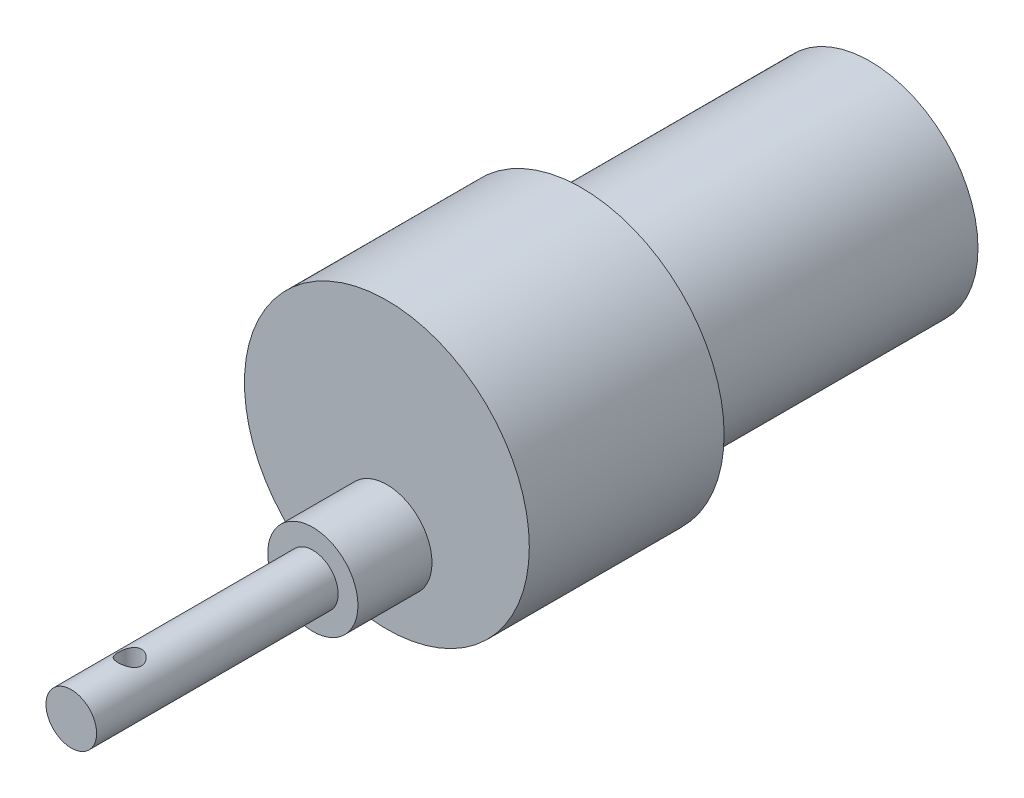
ISO-10303-21;
HEADER;
FILE_DESCRIPTION(('STEP AP214'),'2;1');
FILE_NAME('part.step','',(''),(''),'','','');
FILE_SCHEMA(('AUTOMOTIVE_DESIGN { 1 0 10303 214 1 1 1 1 }'));
ENDSEC;
DATA;
#1=APPLICATION_CONTEXT('core data for automotive mechanical design processes');
#2=APPLICATION_PROTOCOL_DEFINITION('international standard','automotive_design',2000,#1);
#3=PRODUCT_CONTEXT('',#1,'mechanical');
#4=PRODUCT('Part','Part','',(#3));
#5=PRODUCT_RELATED_PRODUCT_CATEGORY('part','',(#4));
#6=PRODUCT_DEFINITION_FORMATION('','',#4);
#7=PRODUCT_DEFINITION_CONTEXT('part definition',#1,'design');
#8=PRODUCT_DEFINITION('design','',#6,#7);
#9=PRODUCT_DEFINITION_SHAPE('','',#8);
#10=(LENGTH_UNIT() NAMED_UNIT(*) SI_UNIT(.MILLI.,.METRE.));
#11=(NAMED_UNIT(*) PLANE_ANGLE_UNIT() SI_UNIT($,.RADIAN.));
#12=(NAMED_UNIT(*) SI_UNIT($,.STERADIAN.) SOLID_ANGLE_UNIT());
#13=UNCERTAINTY_MEASURE_WITH_UNIT(LENGTH_MEASURE(1.E-05),#10,'distance_accuracy_value','');
#14=(GEOMETRIC_REPRESENTATION_CONTEXT(3) GLOBAL_UNCERTAINTY_ASSIGNED_CONTEXT((#13)) GLOBAL_UNIT_ASSIGNED_CONTEXT((#10,
#11,#12)) REPRESENTATION_CONTEXT('',''));
#15=CARTESIAN_POINT('',(0.,0.,0.));
#16=DIRECTION('',(0.,0.,1.));
#17=DIRECTION('',(1.,0.,0.));
#18=AXIS2_PLACEMENT_3D('',#15,#16,#17);
#19=CARTESIAN_POINT('',(0.,0.,62.));
#20=DIRECTION('',(0.,0.,-1.));
#21=DIRECTION('',(-1.,0.,0.));
#22=AXIS2_PLACEMENT_3D('',#19,#20,#21);
#23=CYLINDRICAL_SURFACE('',#22,13.86);
#24=CARTESIAN_POINT('',(0.,0.,0.));
#25=DIRECTION('',(0.,0.,1.));
#26=DIRECTION('',(1.,0.,0.));
#27=AXIS2_PLACEMENT_3D('',#24,#25,#26);
#28=CIRCLE('',#27,13.86);
#29=CARTESIAN_POINT('',(13.86,0.,0.));
#30=VERTEX_POINT('',#29);
#31=EDGE_CURVE('E57',#30,#30,#28,.T.);
#32=ORIENTED_EDGE('',*,*,#31,.T.);
#33=EDGE_LOOP('',(#32));
#34=FACE_BOUND('',#33,.T.);
#35=CARTESIAN_POINT('',(0.,0.,37.));
#36=DIRECTION('',(0.,0.,1.));
#37=DIRECTION('',(1.,0.,0.));
#38=AXIS2_PLACEMENT_3D('',#35,#36,#37);
#39=CIRCLE('',#38,13.86);
#40=CARTESIAN_POINT('',(13.86,0.,37.));
#41=VERTEX_POINT('',#40);
#42=EDGE_CURVE('E51',#41,#41,#39,.T.);
#43=ORIENTED_EDGE('',*,*,#42,.F.);
#44=EDGE_LOOP('',(#43));
#45=FACE_BOUND('',#44,.T.);
#46=ADVANCED_FACE('F38',(#34,#45),#23,.T.);
#47=CARTESIAN_POINT('',(0.,0.,0.));
#48=DIRECTION('',(0.,0.,1.));
#49=DIRECTION('',(1.,0.,0.));
#50=AXIS2_PLACEMENT_3D('',#47,#48,#49);
#51=PLANE('',#50);
#52=ORIENTED_EDGE('',*,*,#31,.F.);
#53=EDGE_LOOP('',(#52));
#54=FACE_BOUND('',#53,.T.);
#55=ADVANCED_FACE('F106',(#54),#51,.F.);
#56=CARTESIAN_POINT('',(0.,0.,62.));
#57=DIRECTION('',(0.,0.,-1.));
#58=DIRECTION('',(-1.,0.,0.));
#59=AXIS2_PLACEMENT_3D('',#56,#57,#58);
#60=CYLINDRICAL_SURFACE('',#59,18.28);
#61=CARTESIAN_POINT('',(0.,0.,62.));
#62=DIRECTION('',(0.,0.,1.));
#63=DIRECTION('',(1.,0.,0.));
#64=AXIS2_PLACEMENT_3D('',#61,#62,#63);
#65=CIRCLE('',#64,18.28);
#66=CARTESIAN_POINT('',(18.28,0.,62.));
#67=VERTEX_POINT('',#66);
#68=EDGE_CURVE('E71',#67,#67,#65,.T.);
#69=ORIENTED_EDGE('',*,*,#68,.F.);
#70=EDGE_LOOP('',(#69));
#71=FACE_BOUND('',#70,.T.);
#72=CARTESIAN_POINT('',(0.,0.,37.));
#73=DIRECTION('',(0.,0.,1.));
#74=DIRECTION('',(1.,0.,0.));
#75=AXIS2_PLACEMENT_3D('',#72,#73,#74);
#76=CIRCLE('',#75,18.28);
#77=CARTESIAN_POINT('',(18.28,0.,37.));
#78=VERTEX_POINT('',#77);
#79=EDGE_CURVE('E66',#78,#78,#76,.T.);
#80=ORIENTED_EDGE('',*,*,#79,.T.);
#81=EDGE_LOOP('',(#80));
#82=FACE_BOUND('',#81,.T.);
#83=ADVANCED_FACE('F111',(#71,#82),#60,.T.);
#84=CARTESIAN_POINT('',(0.,0.,37.));
#85=DIRECTION('',(0.,0.,1.));
#86=DIRECTION('',(1.,0.,0.));
#87=AXIS2_PLACEMENT_3D('',#84,#85,#86);
#88=PLANE('',#87);
#89=ORIENTED_EDGE('',*,*,#42,.T.);
#90=EDGE_LOOP('',(#89));
#91=FACE_BOUND('',#90,.T.);
#92=ORIENTED_EDGE('',*,*,#79,.F.);
#93=EDGE_LOOP('',(#92));
#94=FACE_BOUND('',#93,.T.);
#95=ADVANCED_FACE('F117',(#91,#94),#88,.F.);
#96=CARTESIAN_POINT('',(0.,0.,62.));
#97=DIRECTION('',(0.,0.,1.));
#98=DIRECTION('',(1.,0.,0.));
#99=AXIS2_PLACEMENT_3D('',#96,#97,#98);
#100=PLANE('',#99);
#101=CARTESIAN_POINT('',(0.,-7.99,62.));
#102=DIRECTION('',(0.,0.,1.));
#103=DIRECTION('',(1.,0.,0.));
#104=AXIS2_PLACEMENT_3D('',#101,#102,#103);
#105=CIRCLE('',#104,5.79);
#106=CARTESIAN_POINT('',(5.79,-7.99,62.));
#107=VERTEX_POINT('',#106);
#108=EDGE_CURVE('E67',#107,#107,#105,.T.);
#109=ORIENTED_EDGE('',*,*,#108,.F.);
#110=EDGE_LOOP('',(#109));
#111=FACE_BOUND('',#110,.T.);
#112=ORIENTED_EDGE('',*,*,#68,.T.);
#113=EDGE_LOOP('',(#112));
#114=FACE_BOUND('',#113,.T.);
#115=ADVANCED_FACE('F120',(#111,#114),#100,.T.);
#116=CARTESIAN_POINT('',(0.,-7.99,71.5));
#117=DIRECTION('',(0.,0.,-1.));
#118=DIRECTION('',(-1.,0.,0.));
#119=AXIS2_PLACEMENT_3D('',#116,#117,#118);
#120=CYLINDRICAL_SURFACE('',#119,5.79);
#121=CARTESIAN_POINT('',(0.,-7.99,71.5));
#122=DIRECTION('',(0.,0.,1.));
#123=DIRECTION('',(1.,0.,0.));
#124=AXIS2_PLACEMENT_3D('',#121,#122,#123);
#125=CIRCLE('',#124,5.79);
#126=CARTESIAN_POINT('',(5.79,-7.99,71.5));
#127=VERTEX_POINT('',#126);
#128=EDGE_CURVE('E62',#127,#127,#125,.T.);
#129=ORIENTED_EDGE('',*,*,#128,.F.);
#130=EDGE_LOOP('',(#129));
#131=FACE_BOUND('',#130,.T.);
#132=ORIENTED_EDGE('',*,*,#108,.T.);
#133=EDGE_LOOP('',(#132));
#134=FACE_BOUND('',#133,.T.);
#135=ADVANCED_FACE('F133',(#131,#134),#120,.T.);
#136=CARTESIAN_POINT('',(0.,-7.99,71.5));
#137=DIRECTION('',(0.,0.,1.));
#138=DIRECTION('',(1.,0.,0.));
#139=AXIS2_PLACEMENT_3D('',#136,#137,#138);
#140=PLANE('',#139);
#141=CARTESIAN_POINT('',(0.,-7.99,71.5));
#142=DIRECTION('',(0.,0.,1.));
#143=DIRECTION('',(1.,0.,0.));
#144=AXIS2_PLACEMENT_3D('',#141,#142,#143);
#145=CIRCLE('',#144,3.25);
#146=CARTESIAN_POINT('',(3.25,-7.99,71.5));
#147=VERTEX_POINT('',#146);
#148=EDGE_CURVE('E10',#147,#147,#145,.T.);
#149=ORIENTED_EDGE('',*,*,#148,.F.);
#150=EDGE_LOOP('',(#149));
#151=FACE_BOUND('',#150,.T.);
#152=ORIENTED_EDGE('',*,*,#128,.T.);
#153=EDGE_LOOP('',(#152));
#154=FACE_BOUND('',#153,.T.);
#155=ADVANCED_FACE('F102',(#151,#154),#140,.T.);
#156=CARTESIAN_POINT('',(0.,-7.99,102.5));
#157=DIRECTION('',(0.,0.,-1.));
#158=DIRECTION('',(-1.,0.,0.));
#159=AXIS2_PLACEMENT_3D('',#156,#157,#158);
#160=CYLINDRICAL_SURFACE('',#159,3.25);
#161=CARTESIAN_POINT('',(0.,-11.24,96.5));
#162=CARTESIAN_POINT('',(0.0795665336020402,-11.2399964824728,96.499995787521));
#163=CARTESIAN_POINT('',(0.159248802751997,-11.2370457852304,96.4936318652864));
#164=CARTESIAN_POINT('',(0.316302676462146,-11.2255347898597,96.4684368188158));
#165=CARTESIAN_POINT('',(0.393668644355887,-11.2169618132245,96.4495775159126));
#166=CARTESIAN_POINT('',(0.543571236651895,-11.1951126172015,96.4002613390825));
#167=CARTESIAN_POINT('',(0.616124459577149,-11.1818536812406,96.369847053397));
#168=CARTESIAN_POINT('',(0.75501150586327,-11.1518842864362,96.2984831664503));
#169=CARTESIAN_POINT('',(0.821346455351669,-11.1351744543117,96.2575354778342));
#170=CARTESIAN_POINT('',(0.949934488652826,-11.0988303550097,96.1637412957995));
#171=CARTESIAN_POINT('',(1.01177584846844,-11.0790871070793,96.1103730891206));
#172=CARTESIAN_POINT('',(1.12599874800721,-11.0393100602554,95.9943643723519));
#173=CARTESIAN_POINT('',(1.17837420047774,-11.0192760832839,95.9317179424784));
#174=CARTESIAN_POINT('',(1.27548887178323,-10.9797410102294,95.7941390566843));
#175=CARTESIAN_POINT('',(1.31953284801044,-10.9603543512364,95.7186793017865));
#176=CARTESIAN_POINT('',(1.39412192936299,-10.9260893954615,95.5604132530109));
#177=CARTESIAN_POINT('',(1.42467548371612,-10.9112082786405,95.4776115966009));
#178=CARTESIAN_POINT('',(1.46962454078475,-10.8888457139591,95.3117245268469));
#179=CARTESIAN_POINT('',(1.4848179245708,-10.8810015734653,95.2289063804143));
#180=CARTESIAN_POINT('',(1.50108773838038,-10.8725906668659,95.0615542706928));
#181=CARTESIAN_POINT('',(1.50217478633585,-10.8720184271594,94.9770216459131));
#182=CARTESIAN_POINT('',(1.49079280088205,-10.8779164235216,94.8175256844061));
#183=CARTESIAN_POINT('',(1.47964335102251,-10.8837011993326,94.7424372111908));
#184=CARTESIAN_POINT('',(1.44635609280636,-10.9004806782819,94.5953488838788));
#185=CARTESIAN_POINT('',(1.42421554815286,-10.911476678754,94.5233498037562));
#186=CARTESIAN_POINT('',(1.36913890476633,-10.9376945635919,94.3824957158733));
#187=CARTESIAN_POINT('',(1.33596673085205,-10.9530076322656,94.3137507726206));
#188=CARTESIAN_POINT('',(1.2599408085694,-10.9861251942995,94.1824992310562));
#189=CARTESIAN_POINT('',(1.21708286028503,-11.0039307671733,94.1199953559801));
#190=CARTESIAN_POINT('',(1.11759089744586,-11.0423140447298,93.9960295930866));
#191=CARTESIAN_POINT('',(1.05997849303938,-11.0629856005201,93.9353794713411));
#192=CARTESIAN_POINT('',(0.93525063284136,-11.1032136151515,93.8242944951355));
#193=CARTESIAN_POINT('',(0.868131859637581,-11.1227696813672,93.7738632217161));
#194=CARTESIAN_POINT('',(0.723348423753627,-11.1593883778069,93.6830680936934));
#195=CARTESIAN_POINT('',(0.645401966429369,-11.1763430967401,93.6431066922417));
#196=CARTESIAN_POINT('',(0.482909298354606,-11.2049781510309,93.5771606394507));
#197=CARTESIAN_POINT('',(0.398367620109635,-11.2166620718881,93.5511664844807));
#198=CARTESIAN_POINT('',(0.231801419726399,-11.2327218040747,93.5157584231729));
#199=CARTESIAN_POINT('',(0.150053680320634,-11.2375744913158,93.5052597924311));
#200=CARTESIAN_POINT('',(-0.0141754579229681,-11.241005131626,93.4978189350661));
#201=CARTESIAN_POINT('',(-0.0966565689646179,-11.2395854463303,93.5008716061922));
#202=CARTESIAN_POINT('',(-0.254447728851398,-11.2309269508323,93.5197405086181));
#203=CARTESIAN_POINT('',(-0.329879815922768,-11.2240647154841,93.534731016318));
#204=CARTESIAN_POINT('',(-0.47703968174818,-11.205654730005,93.5758259707681));
#205=CARTESIAN_POINT('',(-0.548767021851264,-11.1941064264594,93.6019317302237));
#206=CARTESIAN_POINT('',(-0.689005049925919,-11.1669534581523,93.6653176562795));
#207=CARTESIAN_POINT('',(-0.75734840788269,-11.1512347190555,93.7029174973217));
#208=CARTESIAN_POINT('',(-0.886999363186387,-11.1173358986766,93.7878753743237));
#209=CARTESIAN_POINT('',(-0.948303850462297,-11.0991547370659,93.8352376981244));
#210=CARTESIAN_POINT('',(-1.06771605589661,-11.0603024090195,93.9431170185809));
#211=CARTESIAN_POINT('',(-1.12509321772053,-11.0395516736676,94.0044158349319));
#212=CARTESIAN_POINT('',(-1.22901796417977,-10.9991743111415,94.1359711553179));
#213=CARTESIAN_POINT('',(-1.27556070251233,-10.9795481899615,94.206231646296));
#214=CARTESIAN_POINT('',(-1.35774539209929,-10.9431533168398,94.3565122225598));
#215=CARTESIAN_POINT('',(-1.39301513194685,-10.9264889220204,94.4367631918532));
#216=CARTESIAN_POINT('',(-1.44918714325353,-10.8991835105804,94.6030877230937));
#217=CARTESIAN_POINT('',(-1.47010488786372,-10.8885360092279,94.689154904117));
#218=CARTESIAN_POINT('',(-1.49529060984287,-10.8756174532217,94.8564321692355));
#219=CARTESIAN_POINT('',(-1.50087454782971,-10.8726853235251,94.9373929418536));
#220=CARTESIAN_POINT('',(-1.49890349615771,-10.8737114444469,95.0990993783274));
#221=CARTESIAN_POINT('',(-1.49135196602765,-10.8776678808026,95.179845093214));
#222=CARTESIAN_POINT('',(-1.4645026372222,-10.89136714358,95.3329450912279));
#223=CARTESIAN_POINT('',(-1.44606164108053,-10.9006867438273,95.4054916725594));
#224=CARTESIAN_POINT('',(-1.39890570133608,-10.9236404902673,95.5464331262932));
#225=CARTESIAN_POINT('',(-1.37018772156748,-10.9372759113608,95.6148267647851));
#226=CARTESIAN_POINT('',(-1.30114142777073,-10.9684312806135,95.7504660004963));
#227=CARTESIAN_POINT('',(-1.26017322224184,-10.9861478662505,95.8173395867084));
#228=CARTESIAN_POINT('',(-1.16858143831045,-11.0230436879651,95.9436688753762));
#229=CARTESIAN_POINT('',(-1.1179534539562,-11.0422235890751,96.0031211723353));
#230=CARTESIAN_POINT('',(-1.00267081983322,-11.0821220762857,96.1189084266444));
#231=CARTESIAN_POINT('',(-0.93713072208963,-11.1028088140642,96.1743773440259));
#232=CARTESIAN_POINT('',(-0.796983612052282,-11.1416023694661,96.2736519598549));
#233=CARTESIAN_POINT('',(-0.722372364022922,-11.1597079732006,96.3174521789542));
#234=CARTESIAN_POINT('',(-0.566452903867861,-11.1912362062055,96.3915937351064));
#235=CARTESIAN_POINT('',(-0.485194228853798,-11.2046901573167,96.4220254800127));
#236=CARTESIAN_POINT('',(-0.318047129151273,-11.2254884135612,96.468442221957));
#237=CARTESIAN_POINT('',(-0.232173392454843,-11.2328510059526,96.4844704732234));
#238=CARTESIAN_POINT('',(-0.121381352624889,-11.2378239925252,96.4952796609948));
#239=CARTESIAN_POINT('',(-0.0971493876498588,-11.2386384195862,96.4970479318607));
#240=CARTESIAN_POINT('',(-0.0486152181100391,-11.2397269656243,96.4994087555787));
#241=CARTESIAN_POINT('',(-0.0243130122848309,-11.2400010748449,96.5000012872002));
#242=CARTESIAN_POINT('',(0.,-11.24,96.5));
#243=B_SPLINE_CURVE_WITH_KNOTS('',3,(#161,#162,#163,#164,#165,#166,#167,#168,#169,#170,#171,
#172,#173,#174,#175,#176,#177,#178,#179,#180,#181,#182,#183,#184,#185,#186,#187,#188,#189,#190,
#191,#192,#193,#194,#195,#196,#197,#198,#199,#200,#201,#202,#203,#204,#205,#206,#207,#208,#209,
#210,#211,#212,#213,#214,#215,#216,#217,#218,#219,#220,#221,#222,#223,#224,#225,#226,#227,#228,
#229,#230,#231,#232,#233,#234,#235,#236,#237,#238,#239,#240,#241,#242),.UNSPECIFIED.,.T.,.F.,(4,
2,2,2,2,2,2,2,2,2,2,2,2,2,2,2,2,2,2,2,2,2,2,2,2,2,2,2,2,2,2,2,2,2,2,2,2,2,2,2,4),(0.,
0.238600102483911,0.477740118245305,0.716007153654809,0.954230955270989,1.20527368348811,
1.45647728005177,1.72361737244145,1.99058991333629,2.24284530975918,2.49491082085965,
2.72224505371486,2.94963591115234,3.18224489338961,3.41495493301191,3.67231630672516,
3.92976771345169,4.19600797435802,4.46206684922304,4.70843465098173,4.95470969975968,
5.18529144757862,5.41590043453886,5.65361863134685,5.89144146118222,6.14975555625564,
6.40818497569821,6.67442949381562,6.94038651584685,7.18267705005868,7.42490378112663,
7.65022078469501,7.87560440949581,8.11582604918685,8.35615752018291,8.6198711271926,
8.88370835055028,9.14573275427445,9.40696763362013,9.47987495044763,9.55278358376661),.UNSPECIFIED.);
#244=CARTESIAN_POINT('',(0.,-11.24,96.5));
#245=VERTEX_POINT('',#244);
#246=EDGE_CURVE('E41',#245,#245,#243,.T.);
#247=ORIENTED_EDGE('',*,*,#246,.T.);
#248=EDGE_LOOP('',(#247));
#249=FACE_BOUND('',#248,.T.);
#250=CARTESIAN_POINT('',(0.,-4.74,96.5));
#251=CARTESIAN_POINT('',(-0.0795665336020402,-4.74000351752723,96.499995787521));
#252=CARTESIAN_POINT('',(-0.159248802751997,-4.74295421476959,96.4936318652864));
#253=CARTESIAN_POINT('',(-0.316302676462146,-4.7544652101403,96.4684368188158));
#254=CARTESIAN_POINT('',(-0.393668644355887,-4.76303818677546,96.4495775159126));
#255=CARTESIAN_POINT('',(-0.543571236651895,-4.7848873827985,96.4002613390825));
#256=CARTESIAN_POINT('',(-0.616124459577149,-4.79814631875943,96.369847053397));
#257=CARTESIAN_POINT('',(-0.75501150586327,-4.82811571356377,96.2984831664503));
#258=CARTESIAN_POINT('',(-0.821346455351669,-4.84482554568835,96.2575354778342));
#259=CARTESIAN_POINT('',(-0.949934488652826,-4.88116964499027,96.1637412957995));
#260=CARTESIAN_POINT('',(-1.01177584846844,-4.90091289292072,96.1103730891206));
#261=CARTESIAN_POINT('',(-1.12599874800721,-4.94068993974456,95.9943643723519));
#262=CARTESIAN_POINT('',(-1.17837420047774,-4.96072391671612,95.9317179424784));
#263=CARTESIAN_POINT('',(-1.27548887178323,-5.00025898977059,95.7941390566843));
#264=CARTESIAN_POINT('',(-1.31953284801044,-5.01964564876359,95.7186793017865));
#265=CARTESIAN_POINT('',(-1.39412192936299,-5.05391060453849,95.5604132530109));
#266=CARTESIAN_POINT('',(-1.42467548371612,-5.06879172135948,95.4776115966009));
#267=CARTESIAN_POINT('',(-1.46962454078475,-5.09115428604094,95.3117245268469));
#268=CARTESIAN_POINT('',(-1.4848179245708,-5.0989984265347,95.2289063804143));
#269=CARTESIAN_POINT('',(-1.50108773838038,-5.10740933313408,95.0615542706928));
#270=CARTESIAN_POINT('',(-1.50217478633585,-5.10798157284062,94.9770216459131));
#271=CARTESIAN_POINT('',(-1.49079280088205,-5.10208357647845,94.8175256844061));
#272=CARTESIAN_POINT('',(-1.47964335102251,-5.09629880066741,94.7424372111908));
#273=CARTESIAN_POINT('',(-1.44635609280636,-5.07951932171808,94.5953488838788));
#274=CARTESIAN_POINT('',(-1.42421554815286,-5.06852332124604,94.5233498037562));
#275=CARTESIAN_POINT('',(-1.36913890476633,-5.04230543640806,94.3824957158733));
#276=CARTESIAN_POINT('',(-1.33596673085205,-5.02699236773443,94.3137507726206));
#277=CARTESIAN_POINT('',(-1.2599408085694,-4.99387480570052,94.1824992310562));
#278=CARTESIAN_POINT('',(-1.21708286028503,-4.97606923282669,94.1199953559801));
#279=CARTESIAN_POINT('',(-1.11759089744586,-4.93768595527021,93.9960295930866));
#280=CARTESIAN_POINT('',(-1.05997849303938,-4.91701439947994,93.9353794713411));
#281=CARTESIAN_POINT('',(-0.935250632841355,-4.87678638484851,93.8242944951355));
#282=CARTESIAN_POINT('',(-0.868131859637579,-4.85723031863276,93.7738632217161));
#283=CARTESIAN_POINT('',(-0.723348423753627,-4.82061162219313,93.6830680936934));
#284=CARTESIAN_POINT('',(-0.64540196642937,-4.80365690325991,93.6431066922417));
#285=CARTESIAN_POINT('',(-0.482909298354606,-4.77502184896911,93.5771606394507));
#286=CARTESIAN_POINT('',(-0.398367620109635,-4.76333792811189,93.5511664844807));
#287=CARTESIAN_POINT('',(-0.231801419726399,-4.7472781959253,93.5157584231729));
#288=CARTESIAN_POINT('',(-0.150053680320635,-4.74242550868423,93.5052597924311));
#289=CARTESIAN_POINT('',(0.0141754579229679,-4.73899486837397,93.4978189350661));
#290=CARTESIAN_POINT('',(0.096656568964618,-4.7404145536697,93.5008716061922));
#291=CARTESIAN_POINT('',(0.254447728851401,-4.74907304916771,93.5197405086181));
#292=CARTESIAN_POINT('',(0.329879815922774,-4.75593528451591,93.534731016318));
#293=CARTESIAN_POINT('',(0.477039681748186,-4.77434526999505,93.5758259707681));
#294=CARTESIAN_POINT('',(0.548767021851267,-4.78589357354064,93.6019317302237));
#295=CARTESIAN_POINT('',(0.689005049925918,-4.81304654184772,93.6653176562795));
#296=CARTESIAN_POINT('',(0.757348407882689,-4.8287652809445,93.7029174973217));
#297=CARTESIAN_POINT('',(0.886999363186382,-4.86266410132341,93.7878753743237));
#298=CARTESIAN_POINT('',(0.948303850462288,-4.88084526293413,93.8352376981244));
#299=CARTESIAN_POINT('',(1.0677160558966,-4.91969759098051,93.9431170185809));
#300=CARTESIAN_POINT('',(1.12509321772053,-4.94044832633235,94.0044158349319));
#301=CARTESIAN_POINT('',(1.22901796417977,-4.98082568885848,94.1359711553179));
#302=CARTESIAN_POINT('',(1.27556070251232,-5.00045181003849,94.206231646296));
#303=CARTESIAN_POINT('',(1.35774539209928,-5.03684668316023,94.3565122225598));
#304=CARTESIAN_POINT('',(1.39301513194685,-5.05351107797963,94.4367631918531));
#305=CARTESIAN_POINT('',(1.44918714325354,-5.08081648941964,94.6030877230937));
#306=CARTESIAN_POINT('',(1.47010488786372,-5.09146399077208,94.6891549041169));
#307=CARTESIAN_POINT('',(1.49529060984287,-5.10438254677831,94.8564321692355));
#308=CARTESIAN_POINT('',(1.50087454782971,-5.1073146764749,94.9373929418536));
#309=CARTESIAN_POINT('',(1.49890349615771,-5.10628855555312,95.0990993783274));
#310=CARTESIAN_POINT('',(1.49135196602765,-5.10233211919738,95.179845093214));
#311=CARTESIAN_POINT('',(1.4645026372222,-5.08863285641999,95.3329450912279));
#312=CARTESIAN_POINT('',(1.44606164108053,-5.07931325617275,95.4054916725594));
#313=CARTESIAN_POINT('',(1.39890570133608,-5.05635950973268,95.5464331262932));
#314=CARTESIAN_POINT('',(1.37018772156748,-5.04272408863924,95.6148267647851));
#315=CARTESIAN_POINT('',(1.30114142777073,-5.01156871938648,95.7504660004963));
#316=CARTESIAN_POINT('',(1.26017322224184,-4.99385213374951,95.8173395867084));
#317=CARTESIAN_POINT('',(1.16858143831045,-4.9569563120349,95.9436688753762));
#318=CARTESIAN_POINT('',(1.1179534539562,-4.93777641092492,96.0031211723353));
#319=CARTESIAN_POINT('',(1.00267081983322,-4.89787792371429,96.1189084266444));
#320=CARTESIAN_POINT('',(0.93713072208963,-4.8771911859358,96.1743773440259));
#321=CARTESIAN_POINT('',(0.796983612052281,-4.83839763053393,96.2736519598549));
#322=CARTESIAN_POINT('',(0.722372364022921,-4.82029202679941,96.3174521789542));
#323=CARTESIAN_POINT('',(0.566452903867861,-4.7887637937945,96.3915937351064));
#324=CARTESIAN_POINT('',(0.485194228853799,-4.77530984268335,96.4220254800127));
#325=CARTESIAN_POINT('',(0.318047129151273,-4.75451158643877,96.468442221957));
#326=CARTESIAN_POINT('',(0.232173392454843,-4.74714899404736,96.4844704732234));
#327=CARTESIAN_POINT('',(0.121381352624889,-4.74217600747479,96.4952796609948));
#328=CARTESIAN_POINT('',(0.0971493876498584,-4.74136158041381,96.4970479318607));
#329=CARTESIAN_POINT('',(0.048615218110039,-4.74027303437565,96.4994087555787));
#330=CARTESIAN_POINT('',(0.0243130122848308,-4.7399989251551,96.5000012872002));
#331=CARTESIAN_POINT('',(0.,-4.74,96.5));
#332=B_SPLINE_CURVE_WITH_KNOTS('',3,(#250,#251,#252,#253,#254,#255,#256,#257,#258,#259,#260,
#261,#262,#263,#264,#265,#266,#267,#268,#269,#270,#271,#272,#273,#274,#275,#276,#277,#278,#279,
#280,#281,#282,#283,#284,#285,#286,#287,#288,#289,#290,#291,#292,#293,#294,#295,#296,#297,#298,
#299,#300,#301,#302,#303,#304,#305,#306,#307,#308,#309,#310,#311,#312,#313,#314,#315,#316,#317,
#318,#319,#320,#321,#322,#323,#324,#325,#326,#327,#328,#329,#330,#331),.UNSPECIFIED.,.T.,.F.,(4,
2,2,2,2,2,2,2,2,2,2,2,2,2,2,2,2,2,2,2,2,2,2,2,2,2,2,2,2,2,2,2,2,2,2,2,2,2,2,2,4),(0.,
0.23860010248391,0.477740118245305,0.716007153654809,0.954230955270988,1.20527368348811,
1.45647728005177,1.72361737244145,1.99058991333629,2.24284530975918,2.49491082085965,
2.72224505371486,2.94963591115234,3.18224489338961,3.41495493301191,3.67231630672516,
3.92976771345169,4.19600797435802,4.46206684922304,4.70843465098173,4.95470969975968,
5.18529144757863,5.41590043453886,5.65361863134685,5.8914414611822,6.14975555625562,
6.4081849756982,6.6744294938156,6.94038651584684,7.18267705005868,7.42490378112662,
7.650220784695,7.8756044094958,8.11582604918685,8.3561575201829,8.61987112719259,
8.88370835055027,9.14573275427444,9.40696763362012,9.47987495044763,9.5527835837666),.UNSPECIFIED.);
#333=CARTESIAN_POINT('',(0.,-4.74,96.5));
#334=VERTEX_POINT('',#333);
#335=EDGE_CURVE('E80',#334,#334,#332,.T.);
#336=ORIENTED_EDGE('',*,*,#335,.T.);
#337=EDGE_LOOP('',(#336));
#338=FACE_BOUND('',#337,.T.);
#339=CARTESIAN_POINT('',(0.,-7.99,102.5));
#340=DIRECTION('',(0.,0.,1.));
#341=DIRECTION('',(1.,0.,0.));
#342=AXIS2_PLACEMENT_3D('',#339,#340,#341);
#343=CIRCLE('',#342,3.25);
#344=CARTESIAN_POINT('',(3.25,-7.99,102.5));
#345=VERTEX_POINT('',#344);
#346=EDGE_CURVE('E61',#345,#345,#343,.T.);
#347=ORIENTED_EDGE('',*,*,#346,.F.);
#348=EDGE_LOOP('',(#347));
#349=FACE_BOUND('',#348,.T.);
#350=ORIENTED_EDGE('',*,*,#148,.T.);
#351=EDGE_LOOP('',(#350));
#352=FACE_BOUND('',#351,.T.);
#353=ADVANCED_FACE('F86',(#249,#338,#349,#352),#160,.T.);
#354=CARTESIAN_POINT('',(0.,-7.99,102.5));
#355=DIRECTION('',(0.,0.,1.));
#356=DIRECTION('',(1.,0.,0.));
#357=AXIS2_PLACEMENT_3D('',#354,#355,#356);
#358=PLANE('',#357);
#359=ORIENTED_EDGE('',*,*,#346,.T.);
#360=EDGE_LOOP('',(#359));
#361=FACE_BOUND('',#360,.T.);
#362=ADVANCED_FACE('F93',(#361),#358,.T.);
#363=CARTESIAN_POINT('',(0.,-20.,95.));
#364=DIRECTION('',(0.,1.,0.));
#365=DIRECTION('',(0.,0.,1.));
#366=AXIS2_PLACEMENT_3D('',#363,#364,#365);
#367=CYLINDRICAL_SURFACE('',#366,1.5);
#368=ORIENTED_EDGE('',*,*,#335,.F.);
#369=EDGE_LOOP('',(#368));
#370=FACE_BOUND('',#369,.T.);
#371=ORIENTED_EDGE('',*,*,#246,.F.);
#372=EDGE_LOOP('',(#371));
#373=FACE_BOUND('',#372,.T.);
#374=ADVANCED_FACE('F90',(#370,#373),#367,.F.);
#375=CLOSED_SHELL('',(#46,#55,#83,#95,#115,#135,#155,#353,#362,#374));
#376=MANIFOLD_SOLID_BREP('B2',#375);
#377=ADVANCED_BREP_SHAPE_REPRESENTATION('',(#18,#376),#14);
#378=SHAPE_DEFINITION_REPRESENTATION(#9,#377);
ENDSEC;
END-ISO-10303-21;
